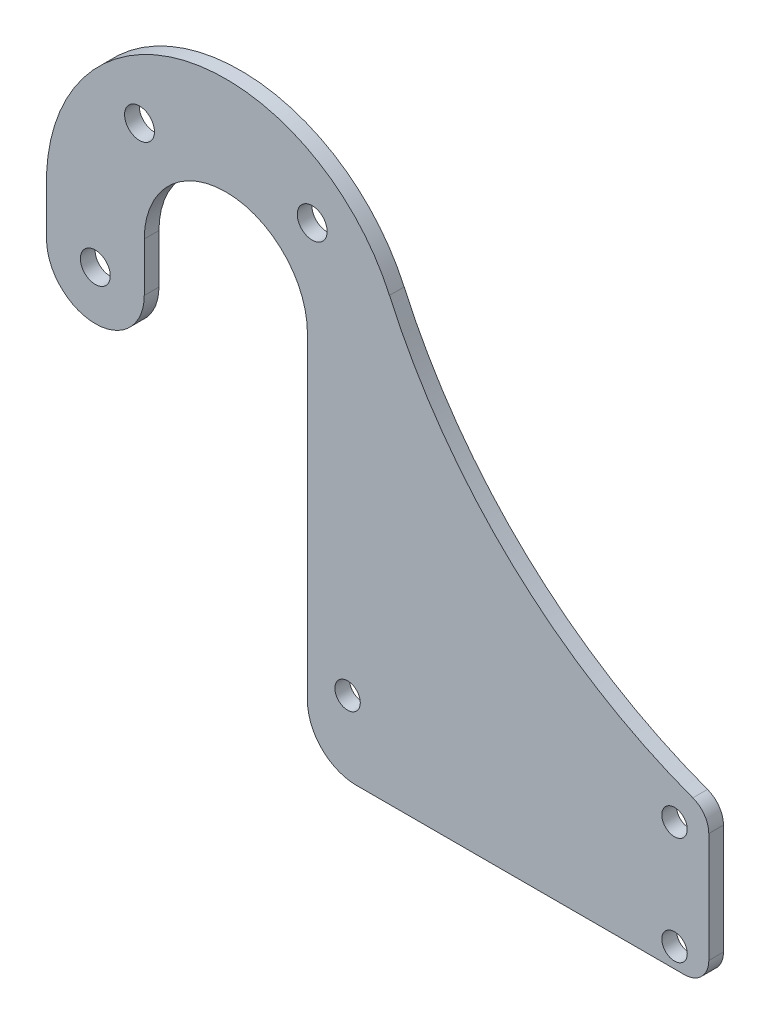
ISO-10303-21;
HEADER;
FILE_DESCRIPTION(('STEP AP214'),'2;1');
FILE_NAME('part.step','',(''),(''),'','','');
FILE_SCHEMA(('AUTOMOTIVE_DESIGN { 1 0 10303 214 1 1 1 1 }'));
ENDSEC;
DATA;
#1=APPLICATION_CONTEXT('core data for automotive mechanical design processes');
#2=APPLICATION_PROTOCOL_DEFINITION('international standard','automotive_design',2000,#1);
#3=PRODUCT_CONTEXT('',#1,'mechanical');
#4=PRODUCT('Part','Part','',(#3));
#5=PRODUCT_RELATED_PRODUCT_CATEGORY('part','',(#4));
#6=PRODUCT_DEFINITION_FORMATION('','',#4);
#7=PRODUCT_DEFINITION_CONTEXT('part definition',#1,'design');
#8=PRODUCT_DEFINITION('design','',#6,#7);
#9=PRODUCT_DEFINITION_SHAPE('','',#8);
#10=(LENGTH_UNIT() NAMED_UNIT(*) SI_UNIT(.MILLI.,.METRE.));
#11=(NAMED_UNIT(*) PLANE_ANGLE_UNIT() SI_UNIT($,.RADIAN.));
#12=(NAMED_UNIT(*) SI_UNIT($,.STERADIAN.) SOLID_ANGLE_UNIT());
#13=UNCERTAINTY_MEASURE_WITH_UNIT(LENGTH_MEASURE(1.E-05),#10,'distance_accuracy_value','');
#14=(GEOMETRIC_REPRESENTATION_CONTEXT(3) GLOBAL_UNCERTAINTY_ASSIGNED_CONTEXT((#13)) GLOBAL_UNIT_ASSIGNED_CONTEXT((#10,
#11,#12)) REPRESENTATION_CONTEXT('',''));
#15=CARTESIAN_POINT('',(0.,0.,0.));
#16=DIRECTION('',(0.,0.,1.));
#17=DIRECTION('',(1.,0.,0.));
#18=AXIS2_PLACEMENT_3D('',#15,#16,#17);
#19=CARTESIAN_POINT('',(-98.66875,75.,3.));
#20=DIRECTION('',(0.,0.,-1.));
#21=DIRECTION('',(-1.,0.,0.));
#22=AXIS2_PLACEMENT_3D('',#19,#20,#21);
#23=CYLINDRICAL_SURFACE('',#22,36.66875);
#24=CARTESIAN_POINT('',(-98.66875,75.,3.));
#25=DIRECTION('',(0.,0.,1.));
#26=DIRECTION('',(1.,0.,0.));
#27=AXIS2_PLACEMENT_3D('',#24,#25,#26);
#28=CIRCLE('',#27,36.66875);
#29=CARTESIAN_POINT('',(-65.2387724582513,90.0676417571123,3.));
#30=VERTEX_POINT('',#29);
#31=CARTESIAN_POINT('',(-135.305624889003,73.4713977201219,3.));
#32=VERTEX_POINT('',#31);
#33=EDGE_CURVE('E185',#30,#32,#28,.T.);
#34=ORIENTED_EDGE('',*,*,#33,.F.);
#35=DIRECTION('',(0.,0.,-1.));
#36=VECTOR('',#35,1.);
#37=CARTESIAN_POINT('',(-65.2387724582513,90.0676417571123,3.));
#38=LINE('',#37,#36);
#39=CARTESIAN_POINT('',(-65.2387724582513,90.0676417571123,0.));
#40=VERTEX_POINT('',#39);
#41=EDGE_CURVE('E190',#30,#40,#38,.T.);
#42=ORIENTED_EDGE('',*,*,#41,.T.);
#43=CARTESIAN_POINT('',(-98.66875,75.,0.));
#44=DIRECTION('',(0.,0.,1.));
#45=DIRECTION('',(1.,0.,0.));
#46=AXIS2_PLACEMENT_3D('',#43,#44,#45);
#47=CIRCLE('',#46,36.66875);
#48=CARTESIAN_POINT('',(-135.305624889003,73.4713977201219,0.));
#49=VERTEX_POINT('',#48);
#50=EDGE_CURVE('E147',#40,#49,#47,.T.);
#51=ORIENTED_EDGE('',*,*,#50,.T.);
#52=DIRECTION('',(0.,0.,-1.));
#53=VECTOR('',#52,1.);
#54=CARTESIAN_POINT('',(-135.305624889003,73.4713977201219,3.));
#55=LINE('',#54,#53);
#56=EDGE_CURVE('E157',#32,#49,#55,.T.);
#57=ORIENTED_EDGE('',*,*,#56,.F.);
#58=EDGE_LOOP('',(#34,#42,#51,#57));
#59=FACE_BOUND('',#58,.T.);
#60=ADVANCED_FACE('F37',(#59),#23,.T.);
#61=CARTESIAN_POINT('',(-135.305624889003,7.51097100565341E-13,3.));
#62=DIRECTION('',(-1.,0.,0.));
#63=DIRECTION('',(0.,-1.,0.));
#64=AXIS2_PLACEMENT_3D('',#61,#62,#63);
#65=PLANE('',#64);
#66=DIRECTION('',(0.,1.,0.));
#67=VECTOR('',#66,1.);
#68=CARTESIAN_POINT('',(-135.305624889003,7.51097100565341E-13,0.));
#69=LINE('',#68,#67);
#70=CARTESIAN_POINT('',(-135.305624889003,65.0000000000001,0.));
#71=VERTEX_POINT('',#70);
#72=EDGE_CURVE('E166',#71,#49,#69,.T.);
#73=ORIENTED_EDGE('',*,*,#72,.F.);
#74=DIRECTION('',(0.,0.,1.));
#75=VECTOR('',#74,1.);
#76=CARTESIAN_POINT('',(-135.305624889003,65.0000000000001,3.));
#77=LINE('',#76,#75);
#78=CARTESIAN_POINT('',(-135.305624889003,65.0000000000001,3.));
#79=VERTEX_POINT('',#78);
#80=EDGE_CURVE('E197',#71,#79,#77,.T.);
#81=ORIENTED_EDGE('',*,*,#80,.T.);
#82=DIRECTION('',(0.,1.,0.));
#83=VECTOR('',#82,1.);
#84=CARTESIAN_POINT('',(-135.305624889003,7.51097100565341E-13,3.));
#85=LINE('',#84,#83);
#86=EDGE_CURVE('E320',#79,#32,#85,.T.);
#87=ORIENTED_EDGE('',*,*,#86,.T.);
#88=ORIENTED_EDGE('',*,*,#56,.T.);
#89=EDGE_LOOP('',(#73,#81,#87,#88));
#90=FACE_BOUND('',#89,.T.);
#91=ADVANCED_FACE('F259',(#90),#65,.T.);
#92=CARTESIAN_POINT('',(-98.66875,75.,3.));
#93=DIRECTION('',(0.,0.,-1.));
#94=DIRECTION('',(-1.,0.,0.));
#95=AXIS2_PLACEMENT_3D('',#92,#93,#94);
#96=CYLINDRICAL_SURFACE('',#95,16.66875);
#97=CARTESIAN_POINT('',(-98.66875,75.,0.));
#98=DIRECTION('',(0.,0.,1.));
#99=DIRECTION('',(1.,0.,0.));
#100=AXIS2_PLACEMENT_3D('',#97,#98,#99);
#101=CIRCLE('',#100,16.66875);
#102=CARTESIAN_POINT('',(-115.3375,75.,0.));
#103=VERTEX_POINT('',#102);
#104=CARTESIAN_POINT('',(-82.,75.,0.));
#105=VERTEX_POINT('',#104);
#106=EDGE_CURVE('E154',#103,#105,#101,.F.);
#107=ORIENTED_EDGE('',*,*,#106,.T.);
#108=DIRECTION('',(0.,0.,-1.));
#109=VECTOR('',#108,1.);
#110=CARTESIAN_POINT('',(-82.,75.,3.));
#111=LINE('',#110,#109);
#112=CARTESIAN_POINT('',(-82.,75.,3.));
#113=VERTEX_POINT('',#112);
#114=EDGE_CURVE('E158',#113,#105,#111,.T.);
#115=ORIENTED_EDGE('',*,*,#114,.F.);
#116=CARTESIAN_POINT('',(-98.66875,75.,3.));
#117=DIRECTION('',(0.,0.,1.));
#118=DIRECTION('',(1.,0.,0.));
#119=AXIS2_PLACEMENT_3D('',#116,#117,#118);
#120=CIRCLE('',#119,16.66875);
#121=CARTESIAN_POINT('',(-115.3375,75.,3.));
#122=VERTEX_POINT('',#121);
#123=EDGE_CURVE('E156',#122,#113,#120,.F.);
#124=ORIENTED_EDGE('',*,*,#123,.F.);
#125=DIRECTION('',(0.,0.,-1.));
#126=VECTOR('',#125,1.);
#127=CARTESIAN_POINT('',(-115.3375,75.,3.));
#128=LINE('',#127,#126);
#129=EDGE_CURVE('E140',#122,#103,#128,.T.);
#130=ORIENTED_EDGE('',*,*,#129,.T.);
#131=EDGE_LOOP('',(#107,#115,#124,#130));
#132=FACE_BOUND('',#131,.T.);
#133=ADVANCED_FACE('F152',(#132),#96,.F.);
#134=CARTESIAN_POINT('',(-82.,0.,3.));
#135=DIRECTION('',(-1.,0.,0.));
#136=DIRECTION('',(0.,0.,1.));
#137=AXIS2_PLACEMENT_3D('',#134,#135,#136);
#138=PLANE('',#137);
#139=DIRECTION('',(0.,1.,0.));
#140=VECTOR('',#139,1.);
#141=CARTESIAN_POINT('',(-82.,0.,0.));
#142=LINE('',#141,#140);
#143=CARTESIAN_POINT('',(-82.,10.,0.));
#144=VERTEX_POINT('',#143);
#145=EDGE_CURVE('E164',#144,#105,#142,.T.);
#146=ORIENTED_EDGE('',*,*,#145,.F.);
#147=DIRECTION('',(0.,0.,-1.));
#148=VECTOR('',#147,1.);
#149=CARTESIAN_POINT('',(-82.,10.,3.));
#150=LINE('',#149,#148);
#151=CARTESIAN_POINT('',(-82.,10.,3.));
#152=VERTEX_POINT('',#151);
#153=EDGE_CURVE('E217',#144,#152,#150,.F.);
#154=ORIENTED_EDGE('',*,*,#153,.T.);
#155=DIRECTION('',(0.,1.,0.));
#156=VECTOR('',#155,1.);
#157=CARTESIAN_POINT('',(-82.,0.,3.));
#158=LINE('',#157,#156);
#159=EDGE_CURVE('E317',#152,#113,#158,.T.);
#160=ORIENTED_EDGE('',*,*,#159,.T.);
#161=ORIENTED_EDGE('',*,*,#114,.T.);
#162=EDGE_LOOP('',(#146,#154,#160,#161));
#163=FACE_BOUND('',#162,.T.);
#164=ADVANCED_FACE('F368',(#163),#138,.T.);
#165=CARTESIAN_POINT('',(0.,0.,3.));
#166=DIRECTION('',(0.,1.,0.));
#167=DIRECTION('',(0.,0.,1.));
#168=AXIS2_PLACEMENT_3D('',#165,#166,#167);
#169=PLANE('',#168);
#170=DIRECTION('',(1.,0.,0.));
#171=VECTOR('',#170,1.);
#172=CARTESIAN_POINT('',(0.,0.,0.));
#173=LINE('',#172,#171);
#174=CARTESIAN_POINT('',(-72.,0.,0.));
#175=VERTEX_POINT('',#174);
#176=CARTESIAN_POINT('',(-5.,0.,0.));
#177=VERTEX_POINT('',#176);
#178=EDGE_CURVE('E168',#175,#177,#173,.T.);
#179=ORIENTED_EDGE('',*,*,#178,.T.);
#180=DIRECTION('',(0.,0.,-1.));
#181=VECTOR('',#180,1.);
#182=CARTESIAN_POINT('',(-5.,0.,3.));
#183=LINE('',#182,#181);
#184=CARTESIAN_POINT('',(-5.,0.,3.));
#185=VERTEX_POINT('',#184);
#186=EDGE_CURVE('E11',#177,#185,#183,.F.);
#187=ORIENTED_EDGE('',*,*,#186,.T.);
#188=DIRECTION('',(1.,0.,0.));
#189=VECTOR('',#188,1.);
#190=CARTESIAN_POINT('',(0.,0.,3.));
#191=LINE('',#190,#189);
#192=CARTESIAN_POINT('',(-72.,0.,3.));
#193=VERTEX_POINT('',#192);
#194=EDGE_CURVE('E315',#193,#185,#191,.T.);
#195=ORIENTED_EDGE('',*,*,#194,.F.);
#196=DIRECTION('',(0.,0.,-1.));
#197=VECTOR('',#196,1.);
#198=CARTESIAN_POINT('',(-72.,0.,0.));
#199=LINE('',#198,#197);
#200=EDGE_CURVE('E209',#193,#175,#199,.T.);
#201=ORIENTED_EDGE('',*,*,#200,.T.);
#202=EDGE_LOOP('',(#179,#187,#195,#201));
#203=FACE_BOUND('',#202,.T.);
#204=ADVANCED_FACE('F365',(#203),#169,.F.);
#205=CARTESIAN_POINT('',(0.,0.,3.));
#206=DIRECTION('',(-1.,0.,0.));
#207=DIRECTION('',(0.,0.,1.));
#208=AXIS2_PLACEMENT_3D('',#205,#206,#207);
#209=PLANE('',#208);
#210=DIRECTION('',(0.,1.,0.));
#211=VECTOR('',#210,1.);
#212=CARTESIAN_POINT('',(0.,0.,0.));
#213=LINE('',#212,#211);
#214=CARTESIAN_POINT('',(0.,5.,0.));
#215=VERTEX_POINT('',#214);
#216=CARTESIAN_POINT('',(0.,27.4655825396053,0.));
#217=VERTEX_POINT('',#216);
#218=EDGE_CURVE('E174',#215,#217,#213,.T.);
#219=ORIENTED_EDGE('',*,*,#218,.T.);
#220=DIRECTION('',(0.,0.,1.));
#221=VECTOR('',#220,1.);
#222=CARTESIAN_POINT('',(0.,27.4655825396053,3.));
#223=LINE('',#222,#221);
#224=CARTESIAN_POINT('',(0.,27.4655825396053,3.));
#225=VERTEX_POINT('',#224);
#226=EDGE_CURVE('E60',#217,#225,#223,.T.);
#227=ORIENTED_EDGE('',*,*,#226,.T.);
#228=DIRECTION('',(0.,1.,0.));
#229=VECTOR('',#228,1.);
#230=CARTESIAN_POINT('',(0.,0.,3.));
#231=LINE('',#230,#229);
#232=CARTESIAN_POINT('',(0.,5.,3.));
#233=VERTEX_POINT('',#232);
#234=EDGE_CURVE('E299',#233,#225,#231,.T.);
#235=ORIENTED_EDGE('',*,*,#234,.F.);
#236=DIRECTION('',(0.,0.,-1.));
#237=VECTOR('',#236,1.);
#238=CARTESIAN_POINT('',(0.,5.,3.));
#239=LINE('',#238,#237);
#240=EDGE_CURVE('E228',#233,#215,#239,.T.);
#241=ORIENTED_EDGE('',*,*,#240,.T.);
#242=EDGE_LOOP('',(#219,#227,#235,#241));
#243=FACE_BOUND('',#242,.T.);
#244=ADVANCED_FACE('F358',(#243),#209,.F.);
#245=CARTESIAN_POINT('',(-7.00000000000001,3.99999999999999,3.));
#246=DIRECTION('',(0.,0.,-1.));
#247=DIRECTION('',(-1.,0.,0.));
#248=AXIS2_PLACEMENT_3D('',#245,#246,#247);
#249=CYLINDRICAL_SURFACE('',#248,2.60000000000002);
#250=CARTESIAN_POINT('',(-7.00000000000001,3.99999999999999,3.));
#251=DIRECTION('',(0.,0.,1.));
#252=DIRECTION('',(1.,0.,0.));
#253=AXIS2_PLACEMENT_3D('',#250,#251,#252);
#254=CIRCLE('',#253,2.60000000000002);
#255=CARTESIAN_POINT('',(-4.39999999999999,3.99999999999999,3.));
#256=VERTEX_POINT('',#255);
#257=EDGE_CURVE('E308',#256,#256,#254,.T.);
#258=ORIENTED_EDGE('',*,*,#257,.T.);
#259=EDGE_LOOP('',(#258));
#260=FACE_BOUND('',#259,.T.);
#261=CARTESIAN_POINT('',(-7.00000000000001,3.99999999999999,0.));
#262=DIRECTION('',(0.,0.,1.));
#263=DIRECTION('',(1.,0.,0.));
#264=AXIS2_PLACEMENT_3D('',#261,#262,#263);
#265=CIRCLE('',#264,2.60000000000002);
#266=CARTESIAN_POINT('',(-4.39999999999999,3.99999999999999,0.));
#267=VERTEX_POINT('',#266);
#268=EDGE_CURVE('E179',#267,#267,#265,.T.);
#269=ORIENTED_EDGE('',*,*,#268,.F.);
#270=EDGE_LOOP('',(#269));
#271=FACE_BOUND('',#270,.T.);
#272=ADVANCED_FACE('F355',(#260,#271),#249,.F.);
#273=CARTESIAN_POINT('',(-7.,26.,3.));
#274=DIRECTION('',(0.,0.,-1.));
#275=DIRECTION('',(-1.,0.,0.));
#276=AXIS2_PLACEMENT_3D('',#273,#274,#275);
#277=CYLINDRICAL_SURFACE('',#276,2.60000000000001);
#278=CARTESIAN_POINT('',(-7.,26.,3.));
#279=DIRECTION('',(0.,0.,1.));
#280=DIRECTION('',(1.,0.,0.));
#281=AXIS2_PLACEMENT_3D('',#278,#279,#280);
#282=CIRCLE('',#281,2.60000000000001);
#283=CARTESIAN_POINT('',(-4.39999999999999,26.,3.));
#284=VERTEX_POINT('',#283);
#285=EDGE_CURVE('E311',#284,#284,#282,.T.);
#286=ORIENTED_EDGE('',*,*,#285,.T.);
#287=EDGE_LOOP('',(#286));
#288=FACE_BOUND('',#287,.T.);
#289=CARTESIAN_POINT('',(-7.,26.,0.));
#290=DIRECTION('',(0.,0.,1.));
#291=DIRECTION('',(1.,0.,0.));
#292=AXIS2_PLACEMENT_3D('',#289,#290,#291);
#293=CIRCLE('',#292,2.60000000000001);
#294=CARTESIAN_POINT('',(-4.39999999999999,26.,0.));
#295=VERTEX_POINT('',#294);
#296=EDGE_CURVE('E176',#295,#295,#293,.T.);
#297=ORIENTED_EDGE('',*,*,#296,.F.);
#298=EDGE_LOOP('',(#297));
#299=FACE_BOUND('',#298,.T.);
#300=ADVANCED_FACE('F353',(#288,#299),#277,.F.);
#301=CARTESIAN_POINT('',(-73.8,15.,3.));
#302=DIRECTION('',(0.,0.,-1.));
#303=DIRECTION('',(-1.,0.,0.));
#304=AXIS2_PLACEMENT_3D('',#301,#302,#303);
#305=CYLINDRICAL_SURFACE('',#304,2.60000000000002);
#306=CARTESIAN_POINT('',(-73.8,15.,3.));
#307=DIRECTION('',(0.,0.,1.));
#308=DIRECTION('',(1.,0.,0.));
#309=AXIS2_PLACEMENT_3D('',#306,#307,#308);
#310=CIRCLE('',#309,2.60000000000002);
#311=CARTESIAN_POINT('',(-71.2,15.,3.));
#312=VERTEX_POINT('',#311);
#313=EDGE_CURVE('E186',#312,#312,#310,.T.);
#314=ORIENTED_EDGE('',*,*,#313,.T.);
#315=EDGE_LOOP('',(#314));
#316=FACE_BOUND('',#315,.T.);
#317=CARTESIAN_POINT('',(-73.8,15.,0.));
#318=DIRECTION('',(0.,0.,1.));
#319=DIRECTION('',(1.,0.,0.));
#320=AXIS2_PLACEMENT_3D('',#317,#318,#319);
#321=CIRCLE('',#320,2.60000000000002);
#322=CARTESIAN_POINT('',(-71.2,15.,0.));
#323=VERTEX_POINT('',#322);
#324=EDGE_CURVE('E182',#323,#323,#321,.T.);
#325=ORIENTED_EDGE('',*,*,#324,.F.);
#326=EDGE_LOOP('',(#325));
#327=FACE_BOUND('',#326,.T.);
#328=ADVANCED_FACE('F334',(#316,#327),#305,.F.);
#329=CARTESIAN_POINT('',(0.,0.,3.));
#330=DIRECTION('',(0.,0.,1.));
#331=DIRECTION('',(1.,0.,0.));
#332=AXIS2_PLACEMENT_3D('',#329,#330,#331);
#333=PLANE('',#332);
#334=CARTESIAN_POINT('',(-81.0272583804544,95.,3.));
#335=DIRECTION('',(0.,0.,1.));
#336=DIRECTION('',(1.,0.,0.));
#337=AXIS2_PLACEMENT_3D('',#334,#335,#336);
#338=CIRCLE('',#337,3.04999999999999);
#339=CARTESIAN_POINT('',(-77.9772583804544,95.,3.));
#340=VERTEX_POINT('',#339);
#341=EDGE_CURVE('E238',#340,#340,#338,.T.);
#342=ORIENTED_EDGE('',*,*,#341,.F.);
#343=EDGE_LOOP('',(#342));
#344=FACE_BOUND('',#343,.T.);
#345=CARTESIAN_POINT('',(-125.3375,65.,3.));
#346=DIRECTION('',(0.,0.,1.));
#347=DIRECTION('',(1.,0.,0.));
#348=AXIS2_PLACEMENT_3D('',#345,#346,#347);
#349=CIRCLE('',#348,3.04999999999999);
#350=CARTESIAN_POINT('',(-122.2875,65.,3.));
#351=VERTEX_POINT('',#350);
#352=EDGE_CURVE('E327',#351,#351,#349,.T.);
#353=ORIENTED_EDGE('',*,*,#352,.F.);
#354=EDGE_LOOP('',(#353));
#355=FACE_BOUND('',#354,.T.);
#356=CARTESIAN_POINT('',(-116.310241619546,95.,3.));
#357=DIRECTION('',(0.,0.,1.));
#358=DIRECTION('',(1.,0.,0.));
#359=AXIS2_PLACEMENT_3D('',#356,#357,#358);
#360=CIRCLE('',#359,3.05000000000019);
#361=CARTESIAN_POINT('',(-113.260241619545,95.,3.));
#362=VERTEX_POINT('',#361);
#363=EDGE_CURVE('E324',#362,#362,#360,.T.);
#364=ORIENTED_EDGE('',*,*,#363,.F.);
#365=EDGE_LOOP('',(#364));
#366=FACE_BOUND('',#365,.T.);
#367=ORIENTED_EDGE('',*,*,#234,.T.);
#368=CARTESIAN_POINT('',(-5.,27.4655825396053,3.));
#369=DIRECTION('',(0.,0.,1.));
#370=DIRECTION('',(1.,0.,0.));
#371=AXIS2_PLACEMENT_3D('',#368,#369,#370);
#372=CIRCLE('',#371,5.);
#373=CARTESIAN_POINT('',(-3.25889294786449,32.1526441172895,3.));
#374=VERTEX_POINT('',#373);
#375=EDGE_CURVE('E46',#225,#374,#372,.T.);
#376=ORIENTED_EDGE('',*,*,#375,.T.);
#377=CARTESIAN_POINT('',(35.0454621991167,135.267998826343,3.));
#378=DIRECTION('',(0.,0.,1.));
#379=DIRECTION('',(1.,0.,0.));
#380=AXIS2_PLACEMENT_3D('',#377,#378,#379);
#381=CIRCLE('',#380,110.);
#382=EDGE_CURVE('E195',#374,#30,#381,.F.);
#383=ORIENTED_EDGE('',*,*,#382,.T.);
#384=ORIENTED_EDGE('',*,*,#33,.T.);
#385=ORIENTED_EDGE('',*,*,#86,.F.);
#386=CARTESIAN_POINT('',(-125.305624889003,65.,3.));
#387=DIRECTION('',(0.,0.,1.));
#388=DIRECTION('',(1.,0.,0.));
#389=AXIS2_PLACEMENT_3D('',#386,#387,#388);
#390=CIRCLE('',#389,10.);
#391=CARTESIAN_POINT('',(-125.321562444501,55.0000127002918,3.));
#392=VERTEX_POINT('',#391);
#393=EDGE_CURVE('E202',#79,#392,#390,.T.);
#394=ORIENTED_EDGE('',*,*,#393,.T.);
#395=CARTESIAN_POINT('',(-125.3375,65.,3.));
#396=DIRECTION('',(0.,0.,1.));
#397=DIRECTION('',(1.,0.,0.));
#398=AXIS2_PLACEMENT_3D('',#395,#396,#397);
#399=CIRCLE('',#398,10.);
#400=CARTESIAN_POINT('',(-115.3375,65.,3.));
#401=VERTEX_POINT('',#400);
#402=EDGE_CURVE('E200',#392,#401,#399,.T.);
#403=ORIENTED_EDGE('',*,*,#402,.T.);
#404=DIRECTION('',(0.,1.,0.));
#405=VECTOR('',#404,1.);
#406=CARTESIAN_POINT('',(-115.3375,0.,3.));
#407=LINE('',#406,#405);
#408=EDGE_CURVE('E148',#401,#122,#407,.T.);
#409=ORIENTED_EDGE('',*,*,#408,.T.);
#410=ORIENTED_EDGE('',*,*,#123,.T.);
#411=ORIENTED_EDGE('',*,*,#159,.F.);
#412=CARTESIAN_POINT('',(-72.,10.,3.));
#413=DIRECTION('',(0.,0.,1.));
#414=DIRECTION('',(1.,0.,0.));
#415=AXIS2_PLACEMENT_3D('',#412,#413,#414);
#416=CIRCLE('',#415,10.);
#417=EDGE_CURVE('E219',#152,#193,#416,.T.);
#418=ORIENTED_EDGE('',*,*,#417,.T.);
#419=ORIENTED_EDGE('',*,*,#194,.T.);
#420=CARTESIAN_POINT('',(-5.,5.,3.));
#421=DIRECTION('',(0.,0.,1.));
#422=DIRECTION('',(1.,0.,0.));
#423=AXIS2_PLACEMENT_3D('',#420,#421,#422);
#424=CIRCLE('',#423,5.);
#425=EDGE_CURVE('E232',#185,#233,#424,.T.);
#426=ORIENTED_EDGE('',*,*,#425,.T.);
#427=EDGE_LOOP('',(#367,#376,#383,#384,#385,#394,#403,#409,#410,#411,#418,#419,#426));
#428=FACE_BOUND('',#427,.T.);
#429=ORIENTED_EDGE('',*,*,#285,.F.);
#430=EDGE_LOOP('',(#429));
#431=FACE_BOUND('',#430,.T.);
#432=ORIENTED_EDGE('',*,*,#257,.F.);
#433=EDGE_LOOP('',(#432));
#434=FACE_BOUND('',#433,.T.);
#435=ORIENTED_EDGE('',*,*,#313,.F.);
#436=EDGE_LOOP('',(#435));
#437=FACE_BOUND('',#436,.T.);
#438=ADVANCED_FACE('F296',(#344,#355,#366,#428,#431,#434,#437),#333,.T.);
#439=CARTESIAN_POINT('',(0.,0.,0.));
#440=DIRECTION('',(0.,0.,1.));
#441=DIRECTION('',(1.,0.,0.));
#442=AXIS2_PLACEMENT_3D('',#439,#440,#441);
#443=PLANE('',#442);
#444=CARTESIAN_POINT('',(-81.0272583804544,95.,0.));
#445=DIRECTION('',(0.,0.,1.));
#446=DIRECTION('',(1.,0.,0.));
#447=AXIS2_PLACEMENT_3D('',#444,#445,#446);
#448=CIRCLE('',#447,3.04999999999999);
#449=CARTESIAN_POINT('',(-77.9772583804544,95.,0.));
#450=VERTEX_POINT('',#449);
#451=EDGE_CURVE('E41',#450,#450,#448,.T.);
#452=ORIENTED_EDGE('',*,*,#451,.T.);
#453=EDGE_LOOP('',(#452));
#454=FACE_BOUND('',#453,.T.);
#455=CARTESIAN_POINT('',(-125.3375,65.,0.));
#456=DIRECTION('',(0.,0.,1.));
#457=DIRECTION('',(1.,0.,0.));
#458=AXIS2_PLACEMENT_3D('',#455,#456,#457);
#459=CIRCLE('',#458,3.04999999999999);
#460=CARTESIAN_POINT('',(-122.2875,65.,0.));
#461=VERTEX_POINT('',#460);
#462=EDGE_CURVE('E237',#461,#461,#459,.T.);
#463=ORIENTED_EDGE('',*,*,#462,.T.);
#464=EDGE_LOOP('',(#463));
#465=FACE_BOUND('',#464,.T.);
#466=CARTESIAN_POINT('',(-116.310241619546,95.,0.));
#467=DIRECTION('',(0.,0.,1.));
#468=DIRECTION('',(1.,0.,0.));
#469=AXIS2_PLACEMENT_3D('',#466,#467,#468);
#470=CIRCLE('',#469,3.05000000000019);
#471=CARTESIAN_POINT('',(-113.260241619545,95.,0.));
#472=VERTEX_POINT('',#471);
#473=EDGE_CURVE('E235',#472,#472,#470,.T.);
#474=ORIENTED_EDGE('',*,*,#473,.T.);
#475=EDGE_LOOP('',(#474));
#476=FACE_BOUND('',#475,.T.);
#477=CARTESIAN_POINT('',(35.0454621991167,135.267998826343,0.));
#478=DIRECTION('',(0.,0.,1.));
#479=DIRECTION('',(1.,0.,0.));
#480=AXIS2_PLACEMENT_3D('',#477,#478,#479);
#481=CIRCLE('',#480,110.);
#482=CARTESIAN_POINT('',(-3.25889294786449,32.1526441172895,0.));
#483=VERTEX_POINT('',#482);
#484=EDGE_CURVE('E193',#40,#483,#481,.T.);
#485=ORIENTED_EDGE('',*,*,#484,.T.);
#486=CARTESIAN_POINT('',(-5.,27.4655825396053,0.));
#487=DIRECTION('',(0.,0.,1.));
#488=DIRECTION('',(1.,0.,0.));
#489=AXIS2_PLACEMENT_3D('',#486,#487,#488);
#490=CIRCLE('',#489,5.);
#491=EDGE_CURVE('E226',#483,#217,#490,.F.);
#492=ORIENTED_EDGE('',*,*,#491,.T.);
#493=ORIENTED_EDGE('',*,*,#218,.F.);
#494=CARTESIAN_POINT('',(-5.,5.,0.));
#495=DIRECTION('',(0.,0.,1.));
#496=DIRECTION('',(1.,0.,0.));
#497=AXIS2_PLACEMENT_3D('',#494,#495,#496);
#498=CIRCLE('',#497,5.);
#499=EDGE_CURVE('E224',#215,#177,#498,.F.);
#500=ORIENTED_EDGE('',*,*,#499,.T.);
#501=ORIENTED_EDGE('',*,*,#178,.F.);
#502=CARTESIAN_POINT('',(-72.,10.,0.));
#503=DIRECTION('',(0.,0.,1.));
#504=DIRECTION('',(1.,0.,0.));
#505=AXIS2_PLACEMENT_3D('',#502,#503,#504);
#506=CIRCLE('',#505,10.);
#507=EDGE_CURVE('E215',#175,#144,#506,.F.);
#508=ORIENTED_EDGE('',*,*,#507,.T.);
#509=ORIENTED_EDGE('',*,*,#145,.T.);
#510=ORIENTED_EDGE('',*,*,#106,.F.);
#511=DIRECTION('',(0.,1.,0.));
#512=VECTOR('',#511,1.);
#513=CARTESIAN_POINT('',(-115.3375,0.,0.));
#514=LINE('',#513,#512);
#515=CARTESIAN_POINT('',(-115.3375,65.,0.));
#516=VERTEX_POINT('',#515);
#517=EDGE_CURVE('E136',#516,#103,#514,.T.);
#518=ORIENTED_EDGE('',*,*,#517,.F.);
#519=CARTESIAN_POINT('',(-125.3375,65.,0.));
#520=DIRECTION('',(0.,0.,1.));
#521=DIRECTION('',(1.,0.,0.));
#522=AXIS2_PLACEMENT_3D('',#519,#520,#521);
#523=CIRCLE('',#522,10.);
#524=CARTESIAN_POINT('',(-125.321562444501,55.0000127002918,0.));
#525=VERTEX_POINT('',#524);
#526=EDGE_CURVE('E204',#516,#525,#523,.F.);
#527=ORIENTED_EDGE('',*,*,#526,.T.);
#528=CARTESIAN_POINT('',(-125.305624889003,65.,0.));
#529=DIRECTION('',(0.,0.,1.));
#530=DIRECTION('',(1.,0.,0.));
#531=AXIS2_PLACEMENT_3D('',#528,#529,#530);
#532=CIRCLE('',#531,10.);
#533=EDGE_CURVE('E206',#525,#71,#532,.F.);
#534=ORIENTED_EDGE('',*,*,#533,.T.);
#535=ORIENTED_EDGE('',*,*,#72,.T.);
#536=ORIENTED_EDGE('',*,*,#50,.F.);
#537=EDGE_LOOP('',(#485,#492,#493,#500,#501,#508,#509,#510,#518,#527,#534,#535,#536));
#538=FACE_BOUND('',#537,.T.);
#539=ORIENTED_EDGE('',*,*,#296,.T.);
#540=EDGE_LOOP('',(#539));
#541=FACE_BOUND('',#540,.T.);
#542=ORIENTED_EDGE('',*,*,#268,.T.);
#543=EDGE_LOOP('',(#542));
#544=FACE_BOUND('',#543,.T.);
#545=ORIENTED_EDGE('',*,*,#324,.T.);
#546=EDGE_LOOP('',(#545));
#547=FACE_BOUND('',#546,.T.);
#548=ADVANCED_FACE('F161',(#454,#465,#476,#538,#541,#544,#547),#443,.F.);
#549=CARTESIAN_POINT('',(35.0454621991167,135.267998826343,3.));
#550=DIRECTION('',(0.,0.,1.));
#551=DIRECTION('',(1.,0.,0.));
#552=AXIS2_PLACEMENT_3D('',#549,#550,#551);
#553=CYLINDRICAL_SURFACE('',#552,110.);
#554=ORIENTED_EDGE('',*,*,#382,.F.);
#555=DIRECTION('',(0.,0.,1.));
#556=VECTOR('',#555,1.);
#557=CARTESIAN_POINT('',(-3.25889294786449,32.1526441172895,3.));
#558=LINE('',#557,#556);
#559=EDGE_CURVE('E221',#374,#483,#558,.F.);
#560=ORIENTED_EDGE('',*,*,#559,.T.);
#561=ORIENTED_EDGE('',*,*,#484,.F.);
#562=ORIENTED_EDGE('',*,*,#41,.F.);
#563=EDGE_LOOP('',(#554,#560,#561,#562));
#564=FACE_BOUND('',#563,.T.);
#565=ADVANCED_FACE('F270',(#564),#553,.F.);
#566=CARTESIAN_POINT('',(-115.3375,0.,0.));
#567=DIRECTION('',(1.,0.,0.));
#568=DIRECTION('',(0.,1.,0.));
#569=AXIS2_PLACEMENT_3D('',#566,#567,#568);
#570=PLANE('',#569);
#571=ORIENTED_EDGE('',*,*,#408,.F.);
#572=DIRECTION('',(0.,0.,1.));
#573=VECTOR('',#572,1.);
#574=CARTESIAN_POINT('',(-115.3375,65.,0.));
#575=LINE('',#574,#573);
#576=EDGE_CURVE('E143',#401,#516,#575,.F.);
#577=ORIENTED_EDGE('',*,*,#576,.T.);
#578=ORIENTED_EDGE('',*,*,#517,.T.);
#579=ORIENTED_EDGE('',*,*,#129,.F.);
#580=EDGE_LOOP('',(#571,#577,#578,#579));
#581=FACE_BOUND('',#580,.T.);
#582=ADVANCED_FACE('F139',(#581),#570,.T.);
#583=CARTESIAN_POINT('',(-125.3375,65.,0.));
#584=DIRECTION('',(0.,0.,1.));
#585=DIRECTION('',(1.,0.,0.));
#586=AXIS2_PLACEMENT_3D('',#583,#584,#585);
#587=CYLINDRICAL_SURFACE('',#586,10.);
#588=DIRECTION('',(0.,0.,1.));
#589=VECTOR('',#588,1.);
#590=CARTESIAN_POINT('',(-125.321562444501,55.0000127002918,1.5));
#591=LINE('',#590,#589);
#592=EDGE_CURVE('E210',#525,#392,#591,.T.);
#593=ORIENTED_EDGE('',*,*,#592,.F.);
#594=ORIENTED_EDGE('',*,*,#526,.F.);
#595=ORIENTED_EDGE('',*,*,#576,.F.);
#596=ORIENTED_EDGE('',*,*,#402,.F.);
#597=EDGE_LOOP('',(#593,#594,#595,#596));
#598=FACE_BOUND('',#597,.T.);
#599=ADVANCED_FACE('F278',(#598),#587,.T.);
#600=CARTESIAN_POINT('',(-125.305624889003,65.,3.));
#601=DIRECTION('',(0.,0.,1.));
#602=DIRECTION('',(1.,0.,0.));
#603=AXIS2_PLACEMENT_3D('',#600,#601,#602);
#604=CYLINDRICAL_SURFACE('',#603,10.);
#605=ORIENTED_EDGE('',*,*,#533,.F.);
#606=ORIENTED_EDGE('',*,*,#592,.T.);
#607=ORIENTED_EDGE('',*,*,#393,.F.);
#608=ORIENTED_EDGE('',*,*,#80,.F.);
#609=EDGE_LOOP('',(#605,#606,#607,#608));
#610=FACE_BOUND('',#609,.T.);
#611=ADVANCED_FACE('F274',(#610),#604,.T.);
#612=CARTESIAN_POINT('',(-72.,10.,3.));
#613=DIRECTION('',(0.,0.,1.));
#614=DIRECTION('',(1.,0.,0.));
#615=AXIS2_PLACEMENT_3D('',#612,#613,#614);
#616=CYLINDRICAL_SURFACE('',#615,10.);
#617=ORIENTED_EDGE('',*,*,#417,.F.);
#618=ORIENTED_EDGE('',*,*,#153,.F.);
#619=ORIENTED_EDGE('',*,*,#507,.F.);
#620=ORIENTED_EDGE('',*,*,#200,.F.);
#621=EDGE_LOOP('',(#617,#618,#619,#620));
#622=FACE_BOUND('',#621,.T.);
#623=ADVANCED_FACE('F277',(#622),#616,.T.);
#624=CARTESIAN_POINT('',(-5.,27.4655825396053,3.));
#625=DIRECTION('',(0.,0.,1.));
#626=DIRECTION('',(1.,0.,0.));
#627=AXIS2_PLACEMENT_3D('',#624,#625,#626);
#628=CYLINDRICAL_SURFACE('',#627,5.);
#629=ORIENTED_EDGE('',*,*,#375,.F.);
#630=ORIENTED_EDGE('',*,*,#226,.F.);
#631=ORIENTED_EDGE('',*,*,#491,.F.);
#632=ORIENTED_EDGE('',*,*,#559,.F.);
#633=EDGE_LOOP('',(#629,#630,#631,#632));
#634=FACE_BOUND('',#633,.T.);
#635=ADVANCED_FACE('F284',(#634),#628,.T.);
#636=CARTESIAN_POINT('',(-5.,5.,3.));
#637=DIRECTION('',(0.,0.,-1.));
#638=DIRECTION('',(-1.,0.,0.));
#639=AXIS2_PLACEMENT_3D('',#636,#637,#638);
#640=CYLINDRICAL_SURFACE('',#639,5.);
#641=ORIENTED_EDGE('',*,*,#425,.F.);
#642=ORIENTED_EDGE('',*,*,#186,.F.);
#643=ORIENTED_EDGE('',*,*,#499,.F.);
#644=ORIENTED_EDGE('',*,*,#240,.F.);
#645=EDGE_LOOP('',(#641,#642,#643,#644));
#646=FACE_BOUND('',#645,.T.);
#647=ADVANCED_FACE('F39',(#646),#640,.T.);
#648=CARTESIAN_POINT('',(-116.310241619546,95.,-7.));
#649=DIRECTION('',(0.,0.,1.));
#650=DIRECTION('',(1.,0.,0.));
#651=AXIS2_PLACEMENT_3D('',#648,#649,#650);
#652=CYLINDRICAL_SURFACE('',#651,3.05000000000019);
#653=ORIENTED_EDGE('',*,*,#363,.T.);
#654=EDGE_LOOP('',(#653));
#655=FACE_BOUND('',#654,.T.);
#656=ORIENTED_EDGE('',*,*,#473,.F.);
#657=EDGE_LOOP('',(#656));
#658=FACE_BOUND('',#657,.T.);
#659=ADVANCED_FACE('F254',(#655,#658),#652,.F.);
#660=CARTESIAN_POINT('',(-125.3375,65.,-7.));
#661=DIRECTION('',(0.,0.,1.));
#662=DIRECTION('',(1.,0.,0.));
#663=AXIS2_PLACEMENT_3D('',#660,#661,#662);
#664=CYLINDRICAL_SURFACE('',#663,3.04999999999999);
#665=ORIENTED_EDGE('',*,*,#352,.T.);
#666=EDGE_LOOP('',(#665));
#667=FACE_BOUND('',#666,.T.);
#668=ORIENTED_EDGE('',*,*,#462,.F.);
#669=EDGE_LOOP('',(#668));
#670=FACE_BOUND('',#669,.T.);
#671=ADVANCED_FACE('F248',(#667,#670),#664,.F.);
#672=CARTESIAN_POINT('',(-81.0272583804544,95.,-7.));
#673=DIRECTION('',(0.,0.,1.));
#674=DIRECTION('',(1.,0.,0.));
#675=AXIS2_PLACEMENT_3D('',#672,#673,#674);
#676=CYLINDRICAL_SURFACE('',#675,3.04999999999999);
#677=ORIENTED_EDGE('',*,*,#341,.T.);
#678=EDGE_LOOP('',(#677));
#679=FACE_BOUND('',#678,.T.);
#680=ORIENTED_EDGE('',*,*,#451,.F.);
#681=EDGE_LOOP('',(#680));
#682=FACE_BOUND('',#681,.T.);
#683=ADVANCED_FACE('F246',(#679,#682),#676,.F.);
#684=CLOSED_SHELL('',(#60,#91,#133,#164,#204,#244,#272,#300,#328,#438,#548,#565,#582,#599,#611,
#623,#635,#647,#659,#671,#683));
#685=MANIFOLD_SOLID_BREP('B2',#684);
#686=ADVANCED_BREP_SHAPE_REPRESENTATION('',(#18,#685),#14);
#687=SHAPE_DEFINITION_REPRESENTATION(#9,#686);
ENDSEC;
END-ISO-10303-21;
